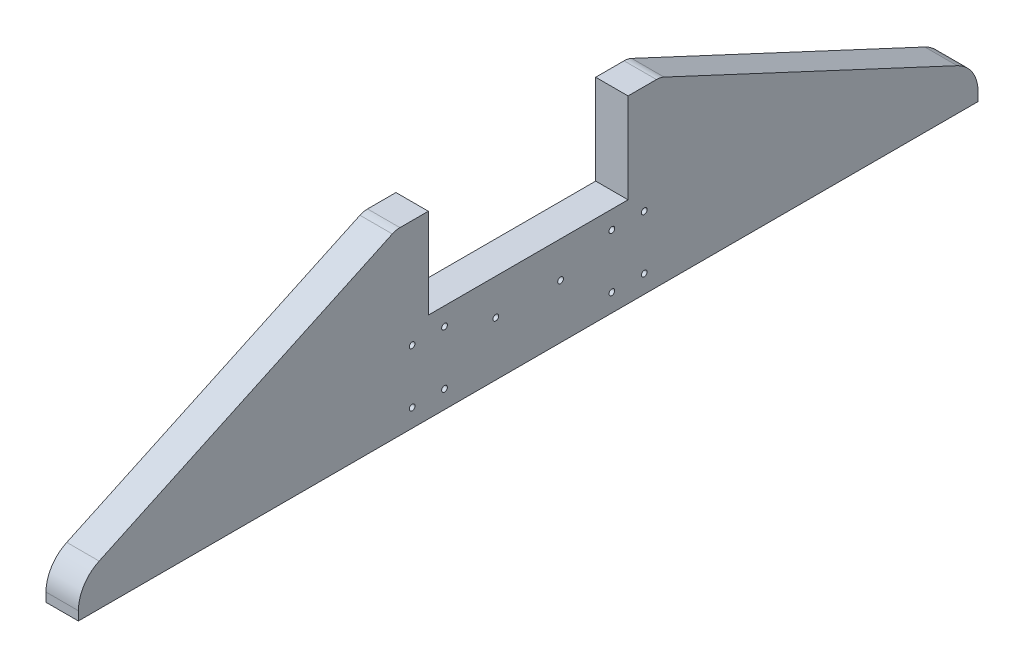
ISO-10303-21;
HEADER;
FILE_DESCRIPTION(('STEP AP214'),'2;1');
FILE_NAME('part.step','',(''),(''),'','','');
FILE_SCHEMA(('AUTOMOTIVE_DESIGN { 1 0 10303 214 1 1 1 1 }'));
ENDSEC;
DATA;
#1=APPLICATION_CONTEXT('core data for automotive mechanical design processes');
#2=APPLICATION_PROTOCOL_DEFINITION('international standard','automotive_design',2000,#1);
#3=PRODUCT_CONTEXT('',#1,'mechanical');
#4=PRODUCT('Part','Part','',(#3));
#5=PRODUCT_RELATED_PRODUCT_CATEGORY('part','',(#4));
#6=PRODUCT_DEFINITION_FORMATION('','',#4);
#7=PRODUCT_DEFINITION_CONTEXT('part definition',#1,'design');
#8=PRODUCT_DEFINITION('design','',#6,#7);
#9=PRODUCT_DEFINITION_SHAPE('','',#8);
#10=(LENGTH_UNIT() NAMED_UNIT(*) SI_UNIT(.MILLI.,.METRE.));
#11=(NAMED_UNIT(*) PLANE_ANGLE_UNIT() SI_UNIT($,.RADIAN.));
#12=(NAMED_UNIT(*) SI_UNIT($,.STERADIAN.) SOLID_ANGLE_UNIT());
#13=UNCERTAINTY_MEASURE_WITH_UNIT(LENGTH_MEASURE(1.E-05),#10,'distance_accuracy_value','');
#14=(GEOMETRIC_REPRESENTATION_CONTEXT(3) GLOBAL_UNCERTAINTY_ASSIGNED_CONTEXT((#13)) GLOBAL_UNIT_ASSIGNED_CONTEXT((#10,
#11,#12)) REPRESENTATION_CONTEXT('',''));
#15=CARTESIAN_POINT('',(0.,0.,0.));
#16=DIRECTION('',(0.,0.,1.));
#17=DIRECTION('',(1.,0.,0.));
#18=AXIS2_PLACEMENT_3D('',#15,#16,#17);
#19=CARTESIAN_POINT('',(18.,0.,500.));
#20=DIRECTION('',(-1.,0.,0.));
#21=DIRECTION('',(0.,-1.,0.));
#22=AXIS2_PLACEMENT_3D('',#19,#20,#21);
#23=PLANE('',#22);
#24=CARTESIAN_POINT('',(18.,30.,268.));
#25=DIRECTION('',(1.,0.,0.));
#26=DIRECTION('',(0.,0.,-1.));
#27=AXIS2_PLACEMENT_3D('',#24,#25,#26);
#28=CIRCLE('',#27,1.5875);
#29=CARTESIAN_POINT('',(18.,30.,266.4125));
#30=VERTEX_POINT('',#29);
#31=EDGE_CURVE('E328',#30,#30,#28,.T.);
#32=ORIENTED_EDGE('',*,*,#31,.F.);
#33=EDGE_LOOP('',(#32));
#34=FACE_BOUND('',#33,.T.);
#35=CARTESIAN_POINT('',(18.,30.,232.));
#36=DIRECTION('',(1.,0.,0.));
#37=DIRECTION('',(0.,0.,-1.));
#38=AXIS2_PLACEMENT_3D('',#35,#36,#37);
#39=CIRCLE('',#38,1.5875);
#40=CARTESIAN_POINT('',(18.,30.,230.4125));
#41=VERTEX_POINT('',#40);
#42=EDGE_CURVE('E324',#41,#41,#39,.T.);
#43=ORIENTED_EDGE('',*,*,#42,.F.);
#44=EDGE_LOOP('',(#43));
#45=FACE_BOUND('',#44,.T.);
#46=CARTESIAN_POINT('',(18.,40.,185.5));
#47=DIRECTION('',(1.,0.,0.));
#48=DIRECTION('',(0.,0.,-1.));
#49=AXIS2_PLACEMENT_3D('',#46,#47,#48);
#50=CIRCLE('',#49,1.5875);
#51=CARTESIAN_POINT('',(18.,40.,183.9125));
#52=VERTEX_POINT('',#51);
#53=EDGE_CURVE('E319',#52,#52,#50,.T.);
#54=ORIENTED_EDGE('',*,*,#53,.F.);
#55=EDGE_LOOP('',(#54));
#56=FACE_BOUND('',#55,.T.);
#57=CARTESIAN_POINT('',(18.,40.,314.5));
#58=DIRECTION('',(1.,0.,0.));
#59=DIRECTION('',(0.,0.,-1.));
#60=AXIS2_PLACEMENT_3D('',#57,#58,#59);
#61=CIRCLE('',#60,1.5875);
#62=CARTESIAN_POINT('',(18.,40.,312.9125));
#63=VERTEX_POINT('',#62);
#64=EDGE_CURVE('E309',#63,#63,#61,.T.);
#65=ORIENTED_EDGE('',*,*,#64,.F.);
#66=EDGE_LOOP('',(#65));
#67=FACE_BOUND('',#66,.T.);
#68=CARTESIAN_POINT('',(18.,9.99999999999998,314.5));
#69=DIRECTION('',(1.,0.,0.));
#70=DIRECTION('',(0.,0.,-1.));
#71=AXIS2_PLACEMENT_3D('',#68,#69,#70);
#72=CIRCLE('',#71,1.5875);
#73=CARTESIAN_POINT('',(18.,9.99999999999998,312.9125));
#74=VERTEX_POINT('',#73);
#75=EDGE_CURVE('E304',#74,#74,#72,.T.);
#76=ORIENTED_EDGE('',*,*,#75,.F.);
#77=EDGE_LOOP('',(#76));
#78=FACE_BOUND('',#77,.T.);
#79=CARTESIAN_POINT('',(18.,40.,296.5));
#80=DIRECTION('',(1.,0.,0.));
#81=DIRECTION('',(0.,0.,-1.));
#82=AXIS2_PLACEMENT_3D('',#79,#80,#81);
#83=CIRCLE('',#82,1.5875);
#84=CARTESIAN_POINT('',(18.,40.,294.9125));
#85=VERTEX_POINT('',#84);
#86=EDGE_CURVE('E299',#85,#85,#83,.T.);
#87=ORIENTED_EDGE('',*,*,#86,.F.);
#88=EDGE_LOOP('',(#87));
#89=FACE_BOUND('',#88,.T.);
#90=CARTESIAN_POINT('',(18.,9.99999999999999,203.5));
#91=DIRECTION('',(1.,0.,0.));
#92=DIRECTION('',(0.,0.,-1.));
#93=AXIS2_PLACEMENT_3D('',#90,#91,#92);
#94=CIRCLE('',#93,1.5875);
#95=CARTESIAN_POINT('',(18.,9.99999999999999,201.9125));
#96=VERTEX_POINT('',#95);
#97=EDGE_CURVE('E294',#96,#96,#94,.T.);
#98=ORIENTED_EDGE('',*,*,#97,.F.);
#99=EDGE_LOOP('',(#98));
#100=FACE_BOUND('',#99,.T.);
#101=CARTESIAN_POINT('',(18.,9.99999999999999,296.5));
#102=DIRECTION('',(1.,0.,0.));
#103=DIRECTION('',(0.,0.,-1.));
#104=AXIS2_PLACEMENT_3D('',#101,#102,#103);
#105=CIRCLE('',#104,1.5875);
#106=CARTESIAN_POINT('',(18.,9.99999999999999,294.9125));
#107=VERTEX_POINT('',#106);
#108=EDGE_CURVE('E289',#107,#107,#105,.T.);
#109=ORIENTED_EDGE('',*,*,#108,.F.);
#110=EDGE_LOOP('',(#109));
#111=FACE_BOUND('',#110,.T.);
#112=CARTESIAN_POINT('',(18.,40.,203.5));
#113=DIRECTION('',(1.,0.,0.));
#114=DIRECTION('',(0.,0.,-1.));
#115=AXIS2_PLACEMENT_3D('',#112,#113,#114);
#116=CIRCLE('',#115,1.5875);
#117=CARTESIAN_POINT('',(18.,40.,201.9125));
#118=VERTEX_POINT('',#117);
#119=EDGE_CURVE('E285',#118,#118,#116,.T.);
#120=ORIENTED_EDGE('',*,*,#119,.F.);
#121=EDGE_LOOP('',(#120));
#122=FACE_BOUND('',#121,.T.);
#123=DIRECTION('',(0.,0.,-1.));
#124=VECTOR('',#123,1.);
#125=CARTESIAN_POINT('',(18.,100.,500.));
#126=LINE('',#125,#124);
#127=CARTESIAN_POINT('',(18.,100.,321.283053373569));
#128=VERTEX_POINT('',#127);
#129=CARTESIAN_POINT('',(18.,100.,305.5));
#130=VERTEX_POINT('',#129);
#131=EDGE_CURVE('E195',#128,#130,#126,.T.);
#132=ORIENTED_EDGE('',*,*,#131,.F.);
#133=CARTESIAN_POINT('',(18.,90.,321.283053373569));
#134=DIRECTION('',(-1.,0.,0.));
#135=DIRECTION('',(0.,-1.,0.));
#136=AXIS2_PLACEMENT_3D('',#133,#134,#135);
#137=CIRCLE('',#136,10.);
#138=CARTESIAN_POINT('',(18.,99.0630778703665,325.509235990976));
#139=VERTEX_POINT('',#138);
#140=EDGE_CURVE('E267',#128,#139,#137,.F.);
#141=ORIENTED_EDGE('',*,*,#140,.T.);
#142=DIRECTION('',(0.,0.422618261740697,-0.906307787036651));
#143=VECTOR('',#142,1.);
#144=CARTESIAN_POINT('',(18.,17.6966983356427,500.));
#145=LINE('',#144,#143);
#146=CARTESIAN_POINT('',(18.,23.0814488602258,488.452365234814));
#147=VERTEX_POINT('',#146);
#148=EDGE_CURVE('E238',#139,#147,#145,.F.);
#149=ORIENTED_EDGE('',*,*,#148,.T.);
#150=CARTESIAN_POINT('',(18.,4.95529311949279,480.));
#151=DIRECTION('',(-1.,0.,0.));
#152=DIRECTION('',(0.,-1.,0.));
#153=AXIS2_PLACEMENT_3D('',#150,#151,#152);
#154=CIRCLE('',#153,20.);
#155=CARTESIAN_POINT('',(18.,4.95529311949279,500.));
#156=VERTEX_POINT('',#155);
#157=EDGE_CURVE('E254',#147,#156,#154,.F.);
#158=ORIENTED_EDGE('',*,*,#157,.T.);
#159=DIRECTION('',(0.,1.,0.));
#160=VECTOR('',#159,1.);
#161=CARTESIAN_POINT('',(18.,0.,500.));
#162=LINE('',#161,#160);
#163=CARTESIAN_POINT('',(18.,0.,500.));
#164=VERTEX_POINT('',#163);
#165=EDGE_CURVE('E215',#164,#156,#162,.T.);
#166=ORIENTED_EDGE('',*,*,#165,.F.);
#167=DIRECTION('',(0.,0.,-1.));
#168=VECTOR('',#167,1.);
#169=CARTESIAN_POINT('',(18.,0.,500.));
#170=LINE('',#169,#168);
#171=CARTESIAN_POINT('',(18.,0.,0.));
#172=VERTEX_POINT('',#171);
#173=EDGE_CURVE('E227',#164,#172,#170,.T.);
#174=ORIENTED_EDGE('',*,*,#173,.T.);
#175=DIRECTION('',(0.,1.,0.));
#176=VECTOR('',#175,1.);
#177=CARTESIAN_POINT('',(18.,0.,0.));
#178=LINE('',#177,#176);
#179=CARTESIAN_POINT('',(18.,4.95529311949279,0.));
#180=VERTEX_POINT('',#179);
#181=EDGE_CURVE('E193',#172,#180,#178,.T.);
#182=ORIENTED_EDGE('',*,*,#181,.T.);
#183=CARTESIAN_POINT('',(18.,4.95529311949279,20.));
#184=DIRECTION('',(-1.,0.,0.));
#185=DIRECTION('',(0.,-1.,0.));
#186=AXIS2_PLACEMENT_3D('',#183,#184,#185);
#187=CIRCLE('',#186,20.);
#188=CARTESIAN_POINT('',(18.,23.0814488602258,11.547634765186));
#189=VERTEX_POINT('',#188);
#190=EDGE_CURVE('E252',#180,#189,#187,.F.);
#191=ORIENTED_EDGE('',*,*,#190,.T.);
#192=DIRECTION('',(0.,0.422618261740697,0.906307787036651));
#193=VECTOR('',#192,1.);
#194=CARTESIAN_POINT('',(18.,100.,176.500000000001));
#195=LINE('',#194,#193);
#196=CARTESIAN_POINT('',(18.,99.0630778703665,174.490764009024));
#197=VERTEX_POINT('',#196);
#198=EDGE_CURVE('E231',#189,#197,#195,.T.);
#199=ORIENTED_EDGE('',*,*,#198,.T.);
#200=CARTESIAN_POINT('',(18.,90.,178.716946626431));
#201=DIRECTION('',(-1.,0.,0.));
#202=DIRECTION('',(0.,-1.,0.));
#203=AXIS2_PLACEMENT_3D('',#200,#201,#202);
#204=CIRCLE('',#203,10.);
#205=CARTESIAN_POINT('',(18.,100.,178.716946626431));
#206=VERTEX_POINT('',#205);
#207=EDGE_CURVE('E265',#197,#206,#204,.F.);
#208=ORIENTED_EDGE('',*,*,#207,.T.);
#209=CARTESIAN_POINT('',(18.,100.,194.5));
#210=VERTEX_POINT('',#209);
#211=EDGE_CURVE('E162',#210,#206,#126,.T.);
#212=ORIENTED_EDGE('',*,*,#211,.F.);
#213=DIRECTION('',(0.,-1.,0.));
#214=VECTOR('',#213,1.);
#215=CARTESIAN_POINT('',(18.,100.,194.5));
#216=LINE('',#215,#214);
#217=CARTESIAN_POINT('',(18.,50.,194.5));
#218=VERTEX_POINT('',#217);
#219=EDGE_CURVE('E141',#210,#218,#216,.T.);
#220=ORIENTED_EDGE('',*,*,#219,.T.);
#221=DIRECTION('',(0.,0.,1.));
#222=VECTOR('',#221,1.);
#223=CARTESIAN_POINT('',(18.,50.,194.5));
#224=LINE('',#223,#222);
#225=CARTESIAN_POINT('',(18.,50.,305.5));
#226=VERTEX_POINT('',#225);
#227=EDGE_CURVE('E152',#218,#226,#224,.T.);
#228=ORIENTED_EDGE('',*,*,#227,.T.);
#229=DIRECTION('',(0.,1.,0.));
#230=VECTOR('',#229,1.);
#231=CARTESIAN_POINT('',(18.,100.,305.5));
#232=LINE('',#231,#230);
#233=EDGE_CURVE('E149',#226,#130,#232,.T.);
#234=ORIENTED_EDGE('',*,*,#233,.T.);
#235=EDGE_LOOP('',(#132,#141,#149,#158,#166,#174,#182,#191,#199,#208,#212,#220,#228,#234));
#236=FACE_BOUND('',#235,.T.);
#237=CARTESIAN_POINT('',(18.,9.99999999999998,185.5));
#238=DIRECTION('',(1.,0.,0.));
#239=DIRECTION('',(0.,0.,-1.));
#240=AXIS2_PLACEMENT_3D('',#237,#238,#239);
#241=CIRCLE('',#240,1.5875);
#242=CARTESIAN_POINT('',(18.,9.99999999999998,183.9125));
#243=VERTEX_POINT('',#242);
#244=EDGE_CURVE('E314',#243,#243,#241,.T.);
#245=ORIENTED_EDGE('',*,*,#244,.F.);
#246=EDGE_LOOP('',(#245));
#247=FACE_BOUND('',#246,.T.);
#248=ADVANCED_FACE('F38',(#34,#45,#56,#67,#78,#89,#100,#111,#122,#236,#247),#23,.F.);
#249=CARTESIAN_POINT('',(0.,100.,500.));
#250=DIRECTION('',(0.,-1.,0.));
#251=DIRECTION('',(0.,0.,-1.));
#252=AXIS2_PLACEMENT_3D('',#249,#250,#251);
#253=PLANE('',#252);
#254=ORIENTED_EDGE('',*,*,#211,.T.);
#255=DIRECTION('',(-1.,0.,0.));
#256=VECTOR('',#255,1.);
#257=CARTESIAN_POINT('',(0.,100.,178.716946626431));
#258=LINE('',#257,#256);
#259=CARTESIAN_POINT('',(0.,100.,178.716946626431));
#260=VERTEX_POINT('',#259);
#261=EDGE_CURVE('E46',#206,#260,#258,.T.);
#262=ORIENTED_EDGE('',*,*,#261,.T.);
#263=DIRECTION('',(0.,0.,-1.));
#264=VECTOR('',#263,1.);
#265=CARTESIAN_POINT('',(0.,100.,500.));
#266=LINE('',#265,#264);
#267=CARTESIAN_POINT('',(0.,100.,194.5));
#268=VERTEX_POINT('',#267);
#269=EDGE_CURVE('E192',#268,#260,#266,.T.);
#270=ORIENTED_EDGE('',*,*,#269,.F.);
#271=DIRECTION('',(-1.,0.,0.));
#272=VECTOR('',#271,1.);
#273=CARTESIAN_POINT('',(18.,100.,194.5));
#274=LINE('',#273,#272);
#275=EDGE_CURVE('E203',#210,#268,#274,.T.);
#276=ORIENTED_EDGE('',*,*,#275,.F.);
#277=EDGE_LOOP('',(#254,#262,#270,#276));
#278=FACE_BOUND('',#277,.T.);
#279=ADVANCED_FACE('F277',(#278),#253,.F.);
#280=CARTESIAN_POINT('',(0.,0.,500.));
#281=DIRECTION('',(1.,0.,0.));
#282=DIRECTION('',(0.,1.,0.));
#283=AXIS2_PLACEMENT_3D('',#280,#281,#282);
#284=PLANE('',#283);
#285=CARTESIAN_POINT('',(0.,30.,268.));
#286=DIRECTION('',(1.,0.,0.));
#287=DIRECTION('',(0.,0.,-1.));
#288=AXIS2_PLACEMENT_3D('',#285,#286,#287);
#289=CIRCLE('',#288,1.5875);
#290=CARTESIAN_POINT('',(0.,30.,266.4125));
#291=VERTEX_POINT('',#290);
#292=EDGE_CURVE('E326',#291,#291,#289,.T.);
#293=ORIENTED_EDGE('',*,*,#292,.T.);
#294=EDGE_LOOP('',(#293));
#295=FACE_BOUND('',#294,.T.);
#296=CARTESIAN_POINT('',(0.,30.,232.));
#297=DIRECTION('',(1.,0.,0.));
#298=DIRECTION('',(0.,0.,-1.));
#299=AXIS2_PLACEMENT_3D('',#296,#297,#298);
#300=CIRCLE('',#299,1.5875);
#301=CARTESIAN_POINT('',(0.,30.,230.4125));
#302=VERTEX_POINT('',#301);
#303=EDGE_CURVE('E321',#302,#302,#300,.T.);
#304=ORIENTED_EDGE('',*,*,#303,.T.);
#305=EDGE_LOOP('',(#304));
#306=FACE_BOUND('',#305,.T.);
#307=CARTESIAN_POINT('',(0.,40.,185.5));
#308=DIRECTION('',(1.,0.,0.));
#309=DIRECTION('',(0.,0.,-1.));
#310=AXIS2_PLACEMENT_3D('',#307,#308,#309);
#311=CIRCLE('',#310,1.5875);
#312=CARTESIAN_POINT('',(0.,40.,183.9125));
#313=VERTEX_POINT('',#312);
#314=EDGE_CURVE('E316',#313,#313,#311,.T.);
#315=ORIENTED_EDGE('',*,*,#314,.T.);
#316=EDGE_LOOP('',(#315));
#317=FACE_BOUND('',#316,.T.);
#318=CARTESIAN_POINT('',(0.,9.99999999999998,185.5));
#319=DIRECTION('',(1.,0.,0.));
#320=DIRECTION('',(0.,0.,-1.));
#321=AXIS2_PLACEMENT_3D('',#318,#319,#320);
#322=CIRCLE('',#321,1.5875);
#323=CARTESIAN_POINT('',(0.,9.99999999999998,183.9125));
#324=VERTEX_POINT('',#323);
#325=EDGE_CURVE('E311',#324,#324,#322,.T.);
#326=ORIENTED_EDGE('',*,*,#325,.T.);
#327=EDGE_LOOP('',(#326));
#328=FACE_BOUND('',#327,.T.);
#329=CARTESIAN_POINT('',(0.,40.,314.5));
#330=DIRECTION('',(1.,0.,0.));
#331=DIRECTION('',(0.,0.,-1.));
#332=AXIS2_PLACEMENT_3D('',#329,#330,#331);
#333=CIRCLE('',#332,1.5875);
#334=CARTESIAN_POINT('',(0.,40.,312.9125));
#335=VERTEX_POINT('',#334);
#336=EDGE_CURVE('E306',#335,#335,#333,.T.);
#337=ORIENTED_EDGE('',*,*,#336,.T.);
#338=EDGE_LOOP('',(#337));
#339=FACE_BOUND('',#338,.T.);
#340=CARTESIAN_POINT('',(0.,9.99999999999998,314.5));
#341=DIRECTION('',(1.,0.,0.));
#342=DIRECTION('',(0.,0.,-1.));
#343=AXIS2_PLACEMENT_3D('',#340,#341,#342);
#344=CIRCLE('',#343,1.5875);
#345=CARTESIAN_POINT('',(0.,9.99999999999998,312.9125));
#346=VERTEX_POINT('',#345);
#347=EDGE_CURVE('E301',#346,#346,#344,.T.);
#348=ORIENTED_EDGE('',*,*,#347,.T.);
#349=EDGE_LOOP('',(#348));
#350=FACE_BOUND('',#349,.T.);
#351=CARTESIAN_POINT('',(0.,40.,296.5));
#352=DIRECTION('',(1.,0.,0.));
#353=DIRECTION('',(0.,0.,-1.));
#354=AXIS2_PLACEMENT_3D('',#351,#352,#353);
#355=CIRCLE('',#354,1.5875);
#356=CARTESIAN_POINT('',(0.,40.,294.9125));
#357=VERTEX_POINT('',#356);
#358=EDGE_CURVE('E296',#357,#357,#355,.T.);
#359=ORIENTED_EDGE('',*,*,#358,.T.);
#360=EDGE_LOOP('',(#359));
#361=FACE_BOUND('',#360,.T.);
#362=CARTESIAN_POINT('',(0.,9.99999999999999,203.5));
#363=DIRECTION('',(1.,0.,0.));
#364=DIRECTION('',(0.,0.,-1.));
#365=AXIS2_PLACEMENT_3D('',#362,#363,#364);
#366=CIRCLE('',#365,1.5875);
#367=CARTESIAN_POINT('',(0.,9.99999999999999,201.9125));
#368=VERTEX_POINT('',#367);
#369=EDGE_CURVE('E291',#368,#368,#366,.T.);
#370=ORIENTED_EDGE('',*,*,#369,.T.);
#371=EDGE_LOOP('',(#370));
#372=FACE_BOUND('',#371,.T.);
#373=CARTESIAN_POINT('',(0.,9.99999999999999,296.5));
#374=DIRECTION('',(1.,0.,0.));
#375=DIRECTION('',(0.,0.,-1.));
#376=AXIS2_PLACEMENT_3D('',#373,#374,#375);
#377=CIRCLE('',#376,1.5875);
#378=CARTESIAN_POINT('',(0.,9.99999999999999,294.9125));
#379=VERTEX_POINT('',#378);
#380=EDGE_CURVE('E286',#379,#379,#377,.T.);
#381=ORIENTED_EDGE('',*,*,#380,.T.);
#382=EDGE_LOOP('',(#381));
#383=FACE_BOUND('',#382,.T.);
#384=CARTESIAN_POINT('',(0.,40.,203.5));
#385=DIRECTION('',(1.,0.,0.));
#386=DIRECTION('',(0.,0.,-1.));
#387=AXIS2_PLACEMENT_3D('',#384,#385,#386);
#388=CIRCLE('',#387,1.5875);
#389=CARTESIAN_POINT('',(0.,40.,201.9125));
#390=VERTEX_POINT('',#389);
#391=EDGE_CURVE('E170',#390,#390,#388,.T.);
#392=ORIENTED_EDGE('',*,*,#391,.T.);
#393=EDGE_LOOP('',(#392));
#394=FACE_BOUND('',#393,.T.);
#395=DIRECTION('',(0.,-0.422618261740697,0.906307787036651));
#396=VECTOR('',#395,1.);
#397=CARTESIAN_POINT('',(0.,17.6966983356427,500.));
#398=LINE('',#397,#396);
#399=CARTESIAN_POINT('',(0.,23.0814488602258,488.452365234814));
#400=VERTEX_POINT('',#399);
#401=CARTESIAN_POINT('',(0.,99.0630778703665,325.509235990976));
#402=VERTEX_POINT('',#401);
#403=EDGE_CURVE('E234',#400,#402,#398,.F.);
#404=ORIENTED_EDGE('',*,*,#403,.T.);
#405=CARTESIAN_POINT('',(0.,90.,321.283053373569));
#406=DIRECTION('',(1.,0.,0.));
#407=DIRECTION('',(0.,1.,0.));
#408=AXIS2_PLACEMENT_3D('',#405,#406,#407);
#409=CIRCLE('',#408,10.);
#410=CARTESIAN_POINT('',(0.,100.,321.283053373569));
#411=VERTEX_POINT('',#410);
#412=EDGE_CURVE('E273',#402,#411,#409,.F.);
#413=ORIENTED_EDGE('',*,*,#412,.T.);
#414=CARTESIAN_POINT('',(0.,100.,305.5));
#415=VERTEX_POINT('',#414);
#416=EDGE_CURVE('E187',#411,#415,#266,.T.);
#417=ORIENTED_EDGE('',*,*,#416,.T.);
#418=DIRECTION('',(0.,1.,0.));
#419=VECTOR('',#418,1.);
#420=CARTESIAN_POINT('',(0.,100.,305.5));
#421=LINE('',#420,#419);
#422=CARTESIAN_POINT('',(0.,50.,305.5));
#423=VERTEX_POINT('',#422);
#424=EDGE_CURVE('E163',#423,#415,#421,.T.);
#425=ORIENTED_EDGE('',*,*,#424,.F.);
#426=DIRECTION('',(0.,0.,1.));
#427=VECTOR('',#426,1.);
#428=CARTESIAN_POINT('',(0.,50.,194.5));
#429=LINE('',#428,#427);
#430=CARTESIAN_POINT('',(0.,50.,194.5));
#431=VERTEX_POINT('',#430);
#432=EDGE_CURVE('E167',#431,#423,#429,.T.);
#433=ORIENTED_EDGE('',*,*,#432,.F.);
#434=DIRECTION('',(0.,-1.,0.));
#435=VECTOR('',#434,1.);
#436=CARTESIAN_POINT('',(0.,100.,194.5));
#437=LINE('',#436,#435);
#438=EDGE_CURVE('E144',#268,#431,#437,.T.);
#439=ORIENTED_EDGE('',*,*,#438,.F.);
#440=ORIENTED_EDGE('',*,*,#269,.T.);
#441=CARTESIAN_POINT('',(0.,90.,178.716946626431));
#442=DIRECTION('',(1.,0.,0.));
#443=DIRECTION('',(0.,1.,0.));
#444=AXIS2_PLACEMENT_3D('',#441,#442,#443);
#445=CIRCLE('',#444,10.);
#446=CARTESIAN_POINT('',(0.,99.0630778703665,174.490764009024));
#447=VERTEX_POINT('',#446);
#448=EDGE_CURVE('E53',#260,#447,#445,.F.);
#449=ORIENTED_EDGE('',*,*,#448,.T.);
#450=DIRECTION('',(0.,-0.422618261740697,-0.906307787036651));
#451=VECTOR('',#450,1.);
#452=CARTESIAN_POINT('',(0.,100.,176.500000000001));
#453=LINE('',#452,#451);
#454=CARTESIAN_POINT('',(0.,23.0814488602258,11.547634765186));
#455=VERTEX_POINT('',#454);
#456=EDGE_CURVE('E226',#447,#455,#453,.T.);
#457=ORIENTED_EDGE('',*,*,#456,.T.);
#458=CARTESIAN_POINT('',(0.,4.95529311949279,20.));
#459=DIRECTION('',(1.,0.,0.));
#460=DIRECTION('',(0.,1.,0.));
#461=AXIS2_PLACEMENT_3D('',#458,#459,#460);
#462=CIRCLE('',#461,20.);
#463=CARTESIAN_POINT('',(0.,4.95529311949279,0.));
#464=VERTEX_POINT('',#463);
#465=EDGE_CURVE('E243',#455,#464,#462,.F.);
#466=ORIENTED_EDGE('',*,*,#465,.T.);
#467=DIRECTION('',(0.,-1.,0.));
#468=VECTOR('',#467,1.);
#469=CARTESIAN_POINT('',(0.,0.,0.));
#470=LINE('',#469,#468);
#471=CARTESIAN_POINT('',(0.,0.,0.));
#472=VERTEX_POINT('',#471);
#473=EDGE_CURVE('E205',#464,#472,#470,.T.);
#474=ORIENTED_EDGE('',*,*,#473,.T.);
#475=DIRECTION('',(0.,0.,-1.));
#476=VECTOR('',#475,1.);
#477=CARTESIAN_POINT('',(0.,0.,500.));
#478=LINE('',#477,#476);
#479=CARTESIAN_POINT('',(0.,0.,500.));
#480=VERTEX_POINT('',#479);
#481=EDGE_CURVE('E222',#480,#472,#478,.T.);
#482=ORIENTED_EDGE('',*,*,#481,.F.);
#483=DIRECTION('',(0.,-1.,0.));
#484=VECTOR('',#483,1.);
#485=CARTESIAN_POINT('',(0.,0.,500.));
#486=LINE('',#485,#484);
#487=CARTESIAN_POINT('',(0.,4.95529311949279,500.));
#488=VERTEX_POINT('',#487);
#489=EDGE_CURVE('E209',#488,#480,#486,.T.);
#490=ORIENTED_EDGE('',*,*,#489,.F.);
#491=CARTESIAN_POINT('',(0.,4.95529311949279,480.));
#492=DIRECTION('',(1.,0.,0.));
#493=DIRECTION('',(0.,1.,0.));
#494=AXIS2_PLACEMENT_3D('',#491,#492,#493);
#495=CIRCLE('',#494,20.);
#496=EDGE_CURVE('E246',#488,#400,#495,.F.);
#497=ORIENTED_EDGE('',*,*,#496,.T.);
#498=EDGE_LOOP('',(#404,#413,#417,#425,#433,#439,#440,#449,#457,#466,#474,#482,#490,#497));
#499=FACE_BOUND('',#498,.T.);
#500=ADVANCED_FACE('F279',(#295,#306,#317,#328,#339,#350,#361,#372,#383,#394,#499),#284,.F.);
#501=CARTESIAN_POINT('',(0.,0.,500.));
#502=DIRECTION('',(0.,1.,0.));
#503=DIRECTION('',(0.,0.,1.));
#504=AXIS2_PLACEMENT_3D('',#501,#502,#503);
#505=PLANE('',#504);
#506=DIRECTION('',(1.,0.,0.));
#507=VECTOR('',#506,1.);
#508=CARTESIAN_POINT('',(0.,0.,0.));
#509=LINE('',#508,#507);
#510=EDGE_CURVE('E220',#472,#172,#509,.T.);
#511=ORIENTED_EDGE('',*,*,#510,.T.);
#512=ORIENTED_EDGE('',*,*,#173,.F.);
#513=DIRECTION('',(1.,0.,0.));
#514=VECTOR('',#513,1.);
#515=CARTESIAN_POINT('',(0.,0.,500.));
#516=LINE('',#515,#514);
#517=EDGE_CURVE('E213',#480,#164,#516,.T.);
#518=ORIENTED_EDGE('',*,*,#517,.F.);
#519=ORIENTED_EDGE('',*,*,#481,.T.);
#520=EDGE_LOOP('',(#511,#512,#518,#519));
#521=FACE_BOUND('',#520,.T.);
#522=ADVANCED_FACE('F382',(#521),#505,.F.);
#523=ORIENTED_EDGE('',*,*,#416,.F.);
#524=DIRECTION('',(-1.,0.,0.));
#525=VECTOR('',#524,1.);
#526=CARTESIAN_POINT('',(18.,100.,321.283053373569));
#527=LINE('',#526,#525);
#528=EDGE_CURVE('E262',#411,#128,#527,.F.);
#529=ORIENTED_EDGE('',*,*,#528,.T.);
#530=ORIENTED_EDGE('',*,*,#131,.T.);
#531=DIRECTION('',(-1.,0.,0.));
#532=VECTOR('',#531,1.);
#533=CARTESIAN_POINT('',(18.,100.,305.5));
#534=LINE('',#533,#532);
#535=EDGE_CURVE('E206',#130,#415,#534,.T.);
#536=ORIENTED_EDGE('',*,*,#535,.T.);
#537=EDGE_LOOP('',(#523,#529,#530,#536));
#538=FACE_BOUND('',#537,.T.);
#539=ADVANCED_FACE('F377',(#538),#253,.F.);
#540=CARTESIAN_POINT('',(0.,0.,500.));
#541=DIRECTION('',(0.,0.,-1.));
#542=DIRECTION('',(-1.,0.,0.));
#543=AXIS2_PLACEMENT_3D('',#540,#541,#542);
#544=PLANE('',#543);
#545=ORIENTED_EDGE('',*,*,#165,.T.);
#546=DIRECTION('',(1.,0.,0.));
#547=VECTOR('',#546,1.);
#548=CARTESIAN_POINT('',(0.,4.95529311949279,500.));
#549=LINE('',#548,#547);
#550=EDGE_CURVE('E240',#156,#488,#549,.F.);
#551=ORIENTED_EDGE('',*,*,#550,.T.);
#552=ORIENTED_EDGE('',*,*,#489,.T.);
#553=ORIENTED_EDGE('',*,*,#517,.T.);
#554=EDGE_LOOP('',(#545,#551,#552,#553));
#555=FACE_BOUND('',#554,.T.);
#556=ADVANCED_FACE('F445',(#555),#544,.F.);
#557=CARTESIAN_POINT('',(0.,0.,0.));
#558=DIRECTION('',(0.,0.,-1.));
#559=DIRECTION('',(-1.,0.,0.));
#560=AXIS2_PLACEMENT_3D('',#557,#558,#559);
#561=PLANE('',#560);
#562=ORIENTED_EDGE('',*,*,#473,.F.);
#563=DIRECTION('',(1.,0.,0.));
#564=VECTOR('',#563,1.);
#565=CARTESIAN_POINT('',(0.,4.95529311949279,0.));
#566=LINE('',#565,#564);
#567=EDGE_CURVE('E256',#464,#180,#566,.T.);
#568=ORIENTED_EDGE('',*,*,#567,.T.);
#569=ORIENTED_EDGE('',*,*,#181,.F.);
#570=ORIENTED_EDGE('',*,*,#510,.F.);
#571=EDGE_LOOP('',(#562,#568,#569,#570));
#572=FACE_BOUND('',#571,.T.);
#573=ADVANCED_FACE('F437',(#572),#561,.T.);
#574=CARTESIAN_POINT('',(18.,100.,194.5));
#575=DIRECTION('',(0.,0.,-1.));
#576=DIRECTION('',(-1.,0.,0.));
#577=AXIS2_PLACEMENT_3D('',#574,#575,#576);
#578=PLANE('',#577);
#579=ORIENTED_EDGE('',*,*,#438,.T.);
#580=DIRECTION('',(-1.,0.,0.));
#581=VECTOR('',#580,1.);
#582=CARTESIAN_POINT('',(18.,50.,194.5));
#583=LINE('',#582,#581);
#584=EDGE_CURVE('E137',#218,#431,#583,.T.);
#585=ORIENTED_EDGE('',*,*,#584,.F.);
#586=ORIENTED_EDGE('',*,*,#219,.F.);
#587=ORIENTED_EDGE('',*,*,#275,.T.);
#588=EDGE_LOOP('',(#579,#585,#586,#587));
#589=FACE_BOUND('',#588,.T.);
#590=ADVANCED_FACE('F139',(#589),#578,.F.);
#591=CARTESIAN_POINT('',(18.,100.,305.5));
#592=DIRECTION('',(0.,0.,1.));
#593=DIRECTION('',(1.,0.,0.));
#594=AXIS2_PLACEMENT_3D('',#591,#592,#593);
#595=PLANE('',#594);
#596=ORIENTED_EDGE('',*,*,#424,.T.);
#597=ORIENTED_EDGE('',*,*,#535,.F.);
#598=ORIENTED_EDGE('',*,*,#233,.F.);
#599=DIRECTION('',(-1.,0.,0.));
#600=VECTOR('',#599,1.);
#601=CARTESIAN_POINT('',(18.,50.,305.5));
#602=LINE('',#601,#600);
#603=EDGE_CURVE('E148',#226,#423,#602,.T.);
#604=ORIENTED_EDGE('',*,*,#603,.T.);
#605=EDGE_LOOP('',(#596,#597,#598,#604));
#606=FACE_BOUND('',#605,.T.);
#607=ADVANCED_FACE('F426',(#606),#595,.F.);
#608=CARTESIAN_POINT('',(18.,50.,194.5));
#609=DIRECTION('',(0.,-1.,0.));
#610=DIRECTION('',(0.,0.,-1.));
#611=AXIS2_PLACEMENT_3D('',#608,#609,#610);
#612=PLANE('',#611);
#613=ORIENTED_EDGE('',*,*,#432,.T.);
#614=ORIENTED_EDGE('',*,*,#603,.F.);
#615=ORIENTED_EDGE('',*,*,#227,.F.);
#616=ORIENTED_EDGE('',*,*,#584,.T.);
#617=EDGE_LOOP('',(#613,#614,#615,#616));
#618=FACE_BOUND('',#617,.T.);
#619=ADVANCED_FACE('F153',(#618),#612,.F.);
#620=CARTESIAN_POINT('',(18.,40.,203.5));
#621=DIRECTION('',(1.,0.,0.));
#622=DIRECTION('',(0.,0.,-1.));
#623=AXIS2_PLACEMENT_3D('',#620,#621,#622);
#624=CYLINDRICAL_SURFACE('',#623,1.5875);
#625=ORIENTED_EDGE('',*,*,#391,.F.);
#626=EDGE_LOOP('',(#625));
#627=FACE_BOUND('',#626,.T.);
#628=ORIENTED_EDGE('',*,*,#119,.T.);
#629=EDGE_LOOP('',(#628));
#630=FACE_BOUND('',#629,.T.);
#631=ADVANCED_FACE('F368',(#627,#630),#624,.F.);
#632=CARTESIAN_POINT('',(18.,9.99999999999999,296.5));
#633=DIRECTION('',(1.,0.,0.));
#634=DIRECTION('',(0.,0.,-1.));
#635=AXIS2_PLACEMENT_3D('',#632,#633,#634);
#636=CYLINDRICAL_SURFACE('',#635,1.5875);
#637=ORIENTED_EDGE('',*,*,#380,.F.);
#638=EDGE_LOOP('',(#637));
#639=FACE_BOUND('',#638,.T.);
#640=ORIENTED_EDGE('',*,*,#108,.T.);
#641=EDGE_LOOP('',(#640));
#642=FACE_BOUND('',#641,.T.);
#643=ADVANCED_FACE('F464',(#639,#642),#636,.F.);
#644=CARTESIAN_POINT('',(18.,9.99999999999999,203.5));
#645=DIRECTION('',(1.,0.,0.));
#646=DIRECTION('',(0.,0.,-1.));
#647=AXIS2_PLACEMENT_3D('',#644,#645,#646);
#648=CYLINDRICAL_SURFACE('',#647,1.5875);
#649=ORIENTED_EDGE('',*,*,#369,.F.);
#650=EDGE_LOOP('',(#649));
#651=FACE_BOUND('',#650,.T.);
#652=ORIENTED_EDGE('',*,*,#97,.T.);
#653=EDGE_LOOP('',(#652));
#654=FACE_BOUND('',#653,.T.);
#655=ADVANCED_FACE('F468',(#651,#654),#648,.F.);
#656=CARTESIAN_POINT('',(18.,40.,296.5));
#657=DIRECTION('',(1.,0.,0.));
#658=DIRECTION('',(0.,0.,-1.));
#659=AXIS2_PLACEMENT_3D('',#656,#657,#658);
#660=CYLINDRICAL_SURFACE('',#659,1.5875);
#661=ORIENTED_EDGE('',*,*,#358,.F.);
#662=EDGE_LOOP('',(#661));
#663=FACE_BOUND('',#662,.T.);
#664=ORIENTED_EDGE('',*,*,#86,.T.);
#665=EDGE_LOOP('',(#664));
#666=FACE_BOUND('',#665,.T.);
#667=ADVANCED_FACE('F392',(#663,#666),#660,.F.);
#668=CARTESIAN_POINT('',(0.,100.,176.500000000001));
#669=DIRECTION('',(0.,0.906307787036651,-0.422618261740697));
#670=DIRECTION('',(1.,0.,0.));
#671=AXIS2_PLACEMENT_3D('',#668,#669,#670);
#672=PLANE('',#671);
#673=ORIENTED_EDGE('',*,*,#456,.F.);
#674=DIRECTION('',(-1.,0.,0.));
#675=VECTOR('',#674,1.);
#676=CARTESIAN_POINT('',(18.,99.0630778703665,174.490764009024));
#677=LINE('',#676,#675);
#678=EDGE_CURVE('E12',#447,#197,#677,.F.);
#679=ORIENTED_EDGE('',*,*,#678,.T.);
#680=ORIENTED_EDGE('',*,*,#198,.F.);
#681=DIRECTION('',(1.,0.,0.));
#682=VECTOR('',#681,1.);
#683=CARTESIAN_POINT('',(0.,23.0814488602258,11.5476347651861));
#684=LINE('',#683,#682);
#685=EDGE_CURVE('E259',#189,#455,#684,.F.);
#686=ORIENTED_EDGE('',*,*,#685,.T.);
#687=EDGE_LOOP('',(#673,#679,#680,#686));
#688=FACE_BOUND('',#687,.T.);
#689=ADVANCED_FACE('F388',(#688),#672,.T.);
#690=CARTESIAN_POINT('',(0.,17.6966983356427,500.));
#691=DIRECTION('',(0.,-0.906307787036651,-0.422618261740697));
#692=DIRECTION('',(-1.,0.,0.));
#693=AXIS2_PLACEMENT_3D('',#690,#691,#692);
#694=PLANE('',#693);
#695=ORIENTED_EDGE('',*,*,#148,.F.);
#696=DIRECTION('',(1.,0.,0.));
#697=VECTOR('',#696,1.);
#698=CARTESIAN_POINT('',(0.,99.0630778703665,325.509235990976));
#699=LINE('',#698,#697);
#700=EDGE_CURVE('E269',#139,#402,#699,.F.);
#701=ORIENTED_EDGE('',*,*,#700,.T.);
#702=ORIENTED_EDGE('',*,*,#403,.F.);
#703=DIRECTION('',(-1.,0.,0.));
#704=VECTOR('',#703,1.);
#705=CARTESIAN_POINT('',(18.,23.0814488602258,488.452365234814));
#706=LINE('',#705,#704);
#707=EDGE_CURVE('E249',#400,#147,#706,.F.);
#708=ORIENTED_EDGE('',*,*,#707,.T.);
#709=EDGE_LOOP('',(#695,#701,#702,#708));
#710=FACE_BOUND('',#709,.T.);
#711=ADVANCED_FACE('F391',(#710),#694,.F.);
#712=CARTESIAN_POINT('',(0.,4.95529311949279,480.));
#713=DIRECTION('',(-1.,0.,0.));
#714=DIRECTION('',(0.,0.,1.));
#715=AXIS2_PLACEMENT_3D('',#712,#713,#714);
#716=CYLINDRICAL_SURFACE('',#715,20.);
#717=ORIENTED_EDGE('',*,*,#157,.F.);
#718=ORIENTED_EDGE('',*,*,#707,.F.);
#719=ORIENTED_EDGE('',*,*,#496,.F.);
#720=ORIENTED_EDGE('',*,*,#550,.F.);
#721=EDGE_LOOP('',(#717,#718,#719,#720));
#722=FACE_BOUND('',#721,.T.);
#723=ADVANCED_FACE('F396',(#722),#716,.T.);
#724=CARTESIAN_POINT('',(0.,4.95529311949279,20.));
#725=DIRECTION('',(1.,0.,0.));
#726=DIRECTION('',(0.,0.,-1.));
#727=AXIS2_PLACEMENT_3D('',#724,#725,#726);
#728=CYLINDRICAL_SURFACE('',#727,20.);
#729=ORIENTED_EDGE('',*,*,#465,.F.);
#730=ORIENTED_EDGE('',*,*,#685,.F.);
#731=ORIENTED_EDGE('',*,*,#190,.F.);
#732=ORIENTED_EDGE('',*,*,#567,.F.);
#733=EDGE_LOOP('',(#729,#730,#731,#732));
#734=FACE_BOUND('',#733,.T.);
#735=ADVANCED_FACE('F400',(#734),#728,.T.);
#736=CARTESIAN_POINT('',(18.,9.99999999999998,314.5));
#737=DIRECTION('',(1.,0.,0.));
#738=DIRECTION('',(0.,0.,-1.));
#739=AXIS2_PLACEMENT_3D('',#736,#737,#738);
#740=CYLINDRICAL_SURFACE('',#739,1.5875);
#741=ORIENTED_EDGE('',*,*,#347,.F.);
#742=EDGE_LOOP('',(#741));
#743=FACE_BOUND('',#742,.T.);
#744=ORIENTED_EDGE('',*,*,#75,.T.);
#745=EDGE_LOOP('',(#744));
#746=FACE_BOUND('',#745,.T.);
#747=ADVANCED_FACE('F403',(#743,#746),#740,.F.);
#748=CARTESIAN_POINT('',(18.,40.,314.5));
#749=DIRECTION('',(1.,0.,0.));
#750=DIRECTION('',(0.,0.,-1.));
#751=AXIS2_PLACEMENT_3D('',#748,#749,#750);
#752=CYLINDRICAL_SURFACE('',#751,1.5875);
#753=ORIENTED_EDGE('',*,*,#336,.F.);
#754=EDGE_LOOP('',(#753));
#755=FACE_BOUND('',#754,.T.);
#756=ORIENTED_EDGE('',*,*,#64,.T.);
#757=EDGE_LOOP('',(#756));
#758=FACE_BOUND('',#757,.T.);
#759=ADVANCED_FACE('F478',(#755,#758),#752,.F.);
#760=CARTESIAN_POINT('',(18.,9.99999999999998,185.5));
#761=DIRECTION('',(1.,0.,0.));
#762=DIRECTION('',(0.,0.,-1.));
#763=AXIS2_PLACEMENT_3D('',#760,#761,#762);
#764=CYLINDRICAL_SURFACE('',#763,1.5875);
#765=ORIENTED_EDGE('',*,*,#325,.F.);
#766=EDGE_LOOP('',(#765));
#767=FACE_BOUND('',#766,.T.);
#768=ORIENTED_EDGE('',*,*,#244,.T.);
#769=EDGE_LOOP('',(#768));
#770=FACE_BOUND('',#769,.T.);
#771=ADVANCED_FACE('F414',(#767,#770),#764,.F.);
#772=CARTESIAN_POINT('',(18.,40.,185.5));
#773=DIRECTION('',(1.,0.,0.));
#774=DIRECTION('',(0.,0.,-1.));
#775=AXIS2_PLACEMENT_3D('',#772,#773,#774);
#776=CYLINDRICAL_SURFACE('',#775,1.5875);
#777=ORIENTED_EDGE('',*,*,#314,.F.);
#778=EDGE_LOOP('',(#777));
#779=FACE_BOUND('',#778,.T.);
#780=ORIENTED_EDGE('',*,*,#53,.T.);
#781=EDGE_LOOP('',(#780));
#782=FACE_BOUND('',#781,.T.);
#783=ADVANCED_FACE('F407',(#779,#782),#776,.F.);
#784=CARTESIAN_POINT('',(0.,90.,321.283053373569));
#785=DIRECTION('',(1.,0.,0.));
#786=DIRECTION('',(0.,0.,-1.));
#787=AXIS2_PLACEMENT_3D('',#784,#785,#786);
#788=CYLINDRICAL_SURFACE('',#787,10.);
#789=ORIENTED_EDGE('',*,*,#412,.F.);
#790=ORIENTED_EDGE('',*,*,#700,.F.);
#791=ORIENTED_EDGE('',*,*,#140,.F.);
#792=ORIENTED_EDGE('',*,*,#528,.F.);
#793=EDGE_LOOP('',(#789,#790,#791,#792));
#794=FACE_BOUND('',#793,.T.);
#795=ADVANCED_FACE('F405',(#794),#788,.T.);
#796=CARTESIAN_POINT('',(0.,90.,178.716946626431));
#797=DIRECTION('',(1.,0.,0.));
#798=DIRECTION('',(0.,0.,-1.));
#799=AXIS2_PLACEMENT_3D('',#796,#797,#798);
#800=CYLINDRICAL_SURFACE('',#799,10.);
#801=ORIENTED_EDGE('',*,*,#207,.F.);
#802=ORIENTED_EDGE('',*,*,#678,.F.);
#803=ORIENTED_EDGE('',*,*,#448,.F.);
#804=ORIENTED_EDGE('',*,*,#261,.F.);
#805=EDGE_LOOP('',(#801,#802,#803,#804));
#806=FACE_BOUND('',#805,.T.);
#807=ADVANCED_FACE('F40',(#806),#800,.T.);
#808=CARTESIAN_POINT('',(18.,30.,232.));
#809=DIRECTION('',(1.,0.,0.));
#810=DIRECTION('',(0.,0.,-1.));
#811=AXIS2_PLACEMENT_3D('',#808,#809,#810);
#812=CYLINDRICAL_SURFACE('',#811,1.5875);
#813=ORIENTED_EDGE('',*,*,#303,.F.);
#814=EDGE_LOOP('',(#813));
#815=FACE_BOUND('',#814,.T.);
#816=ORIENTED_EDGE('',*,*,#42,.T.);
#817=EDGE_LOOP('',(#816));
#818=FACE_BOUND('',#817,.T.);
#819=ADVANCED_FACE('F413',(#815,#818),#812,.F.);
#820=CARTESIAN_POINT('',(18.,30.,268.));
#821=DIRECTION('',(1.,0.,0.));
#822=DIRECTION('',(0.,0.,-1.));
#823=AXIS2_PLACEMENT_3D('',#820,#821,#822);
#824=CYLINDRICAL_SURFACE('',#823,1.5875);
#825=ORIENTED_EDGE('',*,*,#292,.F.);
#826=EDGE_LOOP('',(#825));
#827=FACE_BOUND('',#826,.T.);
#828=ORIENTED_EDGE('',*,*,#31,.T.);
#829=EDGE_LOOP('',(#828));
#830=FACE_BOUND('',#829,.T.);
#831=ADVANCED_FACE('F488',(#827,#830),#824,.F.);
#832=CLOSED_SHELL('',(#248,#279,#500,#522,#539,#556,#573,#590,#607,#619,#631,#643,#655,#667,
#689,#711,#723,#735,#747,#759,#771,#783,#795,#807,#819,#831));
#833=MANIFOLD_SOLID_BREP('B2',#832);
#834=ADVANCED_BREP_SHAPE_REPRESENTATION('',(#18,#833),#14);
#835=SHAPE_DEFINITION_REPRESENTATION(#9,#834);
ENDSEC;
END-ISO-10303-21;
